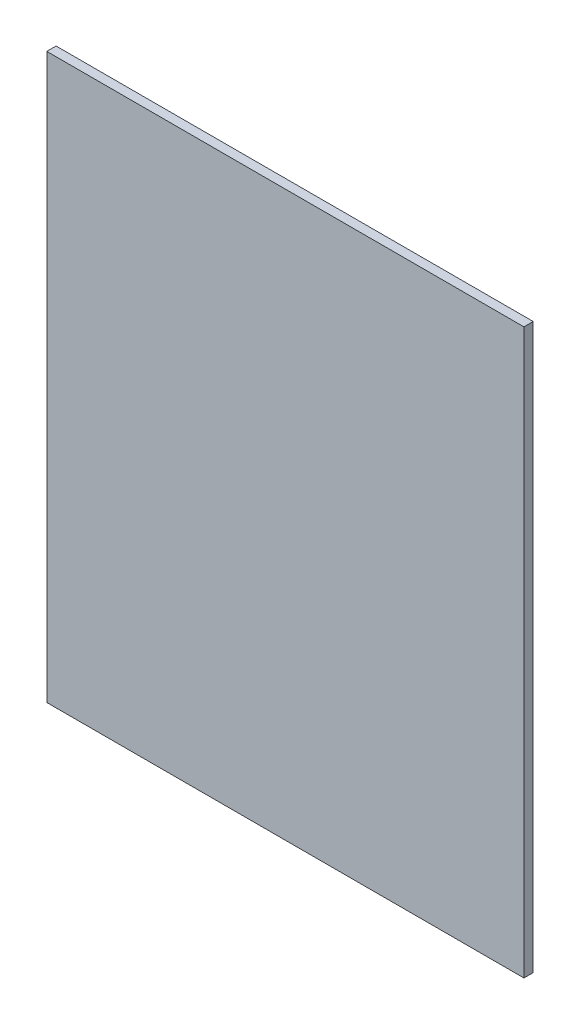
ISO-10303-21;
HEADER;
FILE_DESCRIPTION(('STEP AP214'),'2;1');
FILE_NAME('part.step','',(''),(''),'','','');
FILE_SCHEMA(('AUTOMOTIVE_DESIGN { 1 0 10303 214 1 1 1 1 }'));
ENDSEC;
DATA;
#1=APPLICATION_CONTEXT('core data for automotive mechanical design processes');
#2=APPLICATION_PROTOCOL_DEFINITION('international standard','automotive_design',2000,#1);
#3=PRODUCT_CONTEXT('',#1,'mechanical');
#4=PRODUCT('Part','Part','',(#3));
#5=PRODUCT_RELATED_PRODUCT_CATEGORY('part','',(#4));
#6=PRODUCT_DEFINITION_FORMATION('','',#4);
#7=PRODUCT_DEFINITION_CONTEXT('part definition',#1,'design');
#8=PRODUCT_DEFINITION('design','',#6,#7);
#9=PRODUCT_DEFINITION_SHAPE('','',#8);
#10=(LENGTH_UNIT() NAMED_UNIT(*) SI_UNIT(.MILLI.,.METRE.));
#11=(NAMED_UNIT(*) PLANE_ANGLE_UNIT() SI_UNIT($,.RADIAN.));
#12=(NAMED_UNIT(*) SI_UNIT($,.STERADIAN.) SOLID_ANGLE_UNIT());
#13=UNCERTAINTY_MEASURE_WITH_UNIT(LENGTH_MEASURE(1.E-05),#10,'distance_accuracy_value','');
#14=(GEOMETRIC_REPRESENTATION_CONTEXT(3) GLOBAL_UNCERTAINTY_ASSIGNED_CONTEXT((#13)) GLOBAL_UNIT_ASSIGNED_CONTEXT((#10,
#11,#12)) REPRESENTATION_CONTEXT('',''));
#15=CARTESIAN_POINT('',(0.,0.,0.));
#16=DIRECTION('',(0.,0.,1.));
#17=DIRECTION('',(1.,0.,0.));
#18=AXIS2_PLACEMENT_3D('',#15,#16,#17);
#19=CARTESIAN_POINT('',(0.,0.,1.5));
#20=DIRECTION('',(1.,0.,0.));
#21=DIRECTION('',(0.,1.,0.));
#22=AXIS2_PLACEMENT_3D('',#19,#20,#21);
#23=PLANE('',#22);
#24=DIRECTION('',(0.,-1.,0.));
#25=VECTOR('',#24,1.);
#26=CARTESIAN_POINT('',(0.,0.,0.));
#27=LINE('',#26,#25);
#28=CARTESIAN_POINT('',(0.,0.,0.));
#29=VERTEX_POINT('',#28);
#30=CARTESIAN_POINT('',(0.,-91.,0.));
#31=VERTEX_POINT('',#30);
#32=EDGE_CURVE('E102',#29,#31,#27,.T.);
#33=ORIENTED_EDGE('',*,*,#32,.T.);
#34=DIRECTION('',(0.,0.,-1.));
#35=VECTOR('',#34,1.);
#36=CARTESIAN_POINT('',(0.,-91.,1.5));
#37=LINE('',#36,#35);
#38=CARTESIAN_POINT('',(0.,-91.,1.5));
#39=VERTEX_POINT('',#38);
#40=EDGE_CURVE('E11',#39,#31,#37,.T.);
#41=ORIENTED_EDGE('',*,*,#40,.F.);
#42=DIRECTION('',(0.,-1.,0.));
#43=VECTOR('',#42,1.);
#44=CARTESIAN_POINT('',(0.,0.,1.5));
#45=LINE('',#44,#43);
#46=CARTESIAN_POINT('',(0.,0.,1.5));
#47=VERTEX_POINT('',#46);
#48=EDGE_CURVE('E90',#47,#39,#45,.T.);
#49=ORIENTED_EDGE('',*,*,#48,.F.);
#50=DIRECTION('',(0.,0.,-1.));
#51=VECTOR('',#50,1.);
#52=CARTESIAN_POINT('',(0.,0.,1.5));
#53=LINE('',#52,#51);
#54=EDGE_CURVE('E98',#47,#29,#53,.T.);
#55=ORIENTED_EDGE('',*,*,#54,.T.);
#56=EDGE_LOOP('',(#33,#41,#49,#55));
#57=FACE_BOUND('',#56,.T.);
#58=ADVANCED_FACE('F39',(#57),#23,.F.);
#59=CARTESIAN_POINT('',(0.,-91.,1.5));
#60=DIRECTION('',(0.,1.,0.));
#61=DIRECTION('',(0.,0.,1.));
#62=AXIS2_PLACEMENT_3D('',#59,#60,#61);
#63=PLANE('',#62);
#64=DIRECTION('',(1.,0.,0.));
#65=VECTOR('',#64,1.);
#66=CARTESIAN_POINT('',(0.,-91.,0.));
#67=LINE('',#66,#65);
#68=CARTESIAN_POINT('',(77.,-91.,0.));
#69=VERTEX_POINT('',#68);
#70=EDGE_CURVE('E94',#31,#69,#67,.T.);
#71=ORIENTED_EDGE('',*,*,#70,.T.);
#72=DIRECTION('',(0.,0.,-1.));
#73=VECTOR('',#72,1.);
#74=CARTESIAN_POINT('',(77.,-91.,1.5));
#75=LINE('',#74,#73);
#76=CARTESIAN_POINT('',(77.,-91.,1.5));
#77=VERTEX_POINT('',#76);
#78=EDGE_CURVE('E47',#77,#69,#75,.T.);
#79=ORIENTED_EDGE('',*,*,#78,.F.);
#80=DIRECTION('',(1.,0.,0.));
#81=VECTOR('',#80,1.);
#82=CARTESIAN_POINT('',(0.,-91.,1.5));
#83=LINE('',#82,#81);
#84=EDGE_CURVE('E85',#39,#77,#83,.T.);
#85=ORIENTED_EDGE('',*,*,#84,.F.);
#86=ORIENTED_EDGE('',*,*,#40,.T.);
#87=EDGE_LOOP('',(#71,#79,#85,#86));
#88=FACE_BOUND('',#87,.T.);
#89=ADVANCED_FACE('F93',(#88),#63,.F.);
#90=CARTESIAN_POINT('',(77.,0.,1.5));
#91=DIRECTION('',(-1.,0.,0.));
#92=DIRECTION('',(0.,-1.,0.));
#93=AXIS2_PLACEMENT_3D('',#90,#91,#92);
#94=PLANE('',#93);
#95=DIRECTION('',(0.,1.,0.));
#96=VECTOR('',#95,1.);
#97=CARTESIAN_POINT('',(77.,0.,0.));
#98=LINE('',#97,#96);
#99=CARTESIAN_POINT('',(77.,0.,0.));
#100=VERTEX_POINT('',#99);
#101=EDGE_CURVE('E72',#69,#100,#98,.T.);
#102=ORIENTED_EDGE('',*,*,#101,.T.);
#103=DIRECTION('',(0.,0.,-1.));
#104=VECTOR('',#103,1.);
#105=CARTESIAN_POINT('',(77.,0.,1.5));
#106=LINE('',#105,#104);
#107=CARTESIAN_POINT('',(77.,0.,1.5));
#108=VERTEX_POINT('',#107);
#109=EDGE_CURVE('E95',#108,#100,#106,.T.);
#110=ORIENTED_EDGE('',*,*,#109,.F.);
#111=DIRECTION('',(0.,1.,0.));
#112=VECTOR('',#111,1.);
#113=CARTESIAN_POINT('',(77.,0.,1.5));
#114=LINE('',#113,#112);
#115=EDGE_CURVE('E88',#77,#108,#114,.T.);
#116=ORIENTED_EDGE('',*,*,#115,.F.);
#117=ORIENTED_EDGE('',*,*,#78,.T.);
#118=EDGE_LOOP('',(#102,#110,#116,#117));
#119=FACE_BOUND('',#118,.T.);
#120=ADVANCED_FACE('F96',(#119),#94,.F.);
#121=CARTESIAN_POINT('',(0.,0.,1.5));
#122=DIRECTION('',(0.,-1.,0.));
#123=DIRECTION('',(0.,0.,-1.));
#124=AXIS2_PLACEMENT_3D('',#121,#122,#123);
#125=PLANE('',#124);
#126=DIRECTION('',(-1.,0.,0.));
#127=VECTOR('',#126,1.);
#128=CARTESIAN_POINT('',(0.,0.,0.));
#129=LINE('',#128,#127);
#130=EDGE_CURVE('E78',#100,#29,#129,.T.);
#131=ORIENTED_EDGE('',*,*,#130,.T.);
#132=ORIENTED_EDGE('',*,*,#54,.F.);
#133=DIRECTION('',(-1.,0.,0.));
#134=VECTOR('',#133,1.);
#135=CARTESIAN_POINT('',(0.,0.,1.5));
#136=LINE('',#135,#134);
#137=EDGE_CURVE('E55',#108,#47,#136,.T.);
#138=ORIENTED_EDGE('',*,*,#137,.F.);
#139=ORIENTED_EDGE('',*,*,#109,.T.);
#140=EDGE_LOOP('',(#131,#132,#138,#139));
#141=FACE_BOUND('',#140,.T.);
#142=ADVANCED_FACE('F109',(#141),#125,.F.);
#143=CARTESIAN_POINT('',(0.,0.,1.5));
#144=DIRECTION('',(0.,0.,1.));
#145=DIRECTION('',(1.,0.,0.));
#146=AXIS2_PLACEMENT_3D('',#143,#144,#145);
#147=PLANE('',#146);
#148=ORIENTED_EDGE('',*,*,#48,.T.);
#149=ORIENTED_EDGE('',*,*,#84,.T.);
#150=ORIENTED_EDGE('',*,*,#115,.T.);
#151=ORIENTED_EDGE('',*,*,#137,.T.);
#152=EDGE_LOOP('',(#148,#149,#150,#151));
#153=FACE_BOUND('',#152,.T.);
#154=ADVANCED_FACE('F86',(#153),#147,.T.);
#155=CARTESIAN_POINT('',(0.,0.,0.));
#156=DIRECTION('',(0.,0.,1.));
#157=DIRECTION('',(1.,0.,0.));
#158=AXIS2_PLACEMENT_3D('',#155,#156,#157);
#159=PLANE('',#158);
#160=ORIENTED_EDGE('',*,*,#32,.F.);
#161=ORIENTED_EDGE('',*,*,#130,.F.);
#162=ORIENTED_EDGE('',*,*,#101,.F.);
#163=ORIENTED_EDGE('',*,*,#70,.F.);
#164=EDGE_LOOP('',(#160,#161,#162,#163));
#165=FACE_BOUND('',#164,.T.);
#166=ADVANCED_FACE('F112',(#165),#159,.F.);
#167=CLOSED_SHELL('',(#58,#89,#120,#142,#154,#166));
#168=MANIFOLD_SOLID_BREP('B2',#167);
#169=ADVANCED_BREP_SHAPE_REPRESENTATION('',(#18,#168),#14);
#170=SHAPE_DEFINITION_REPRESENTATION(#9,#169);
ENDSEC;
END-ISO-10303-21;
